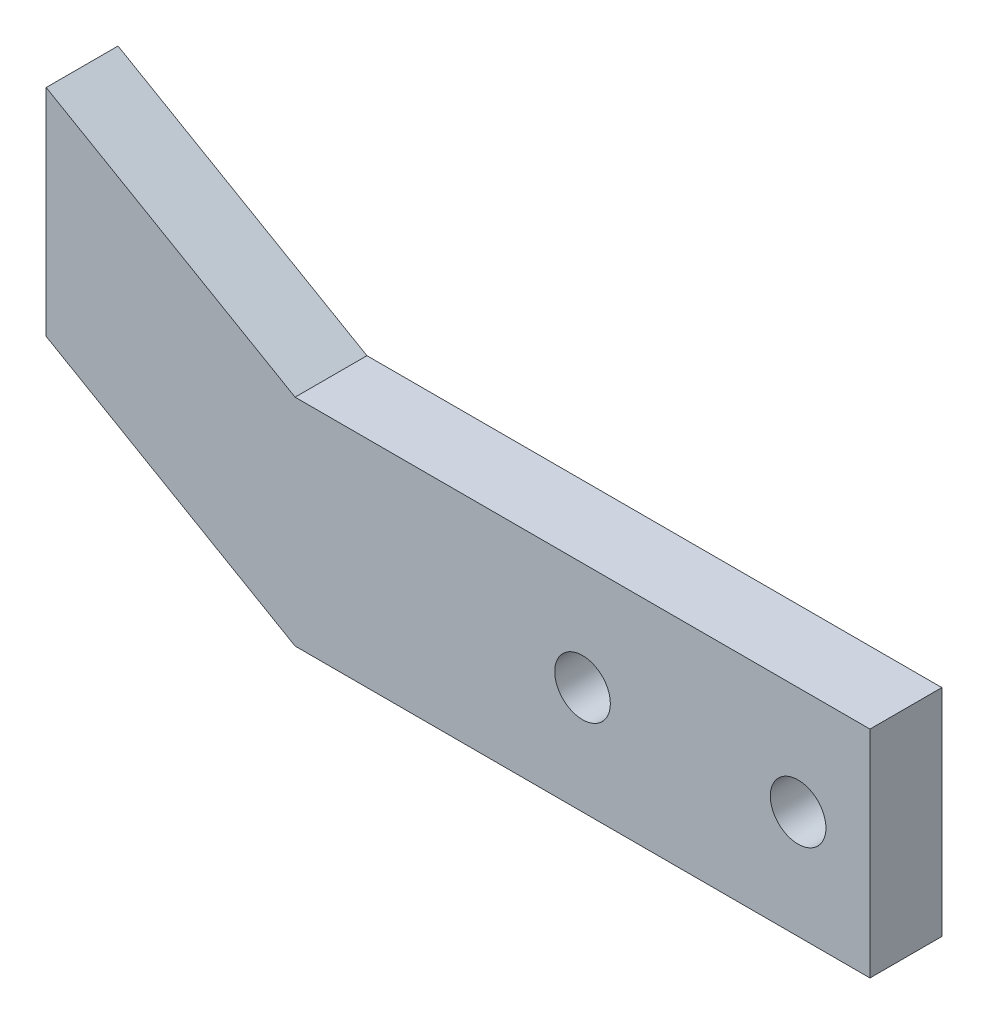
ISO-10303-21;
HEADER;
FILE_DESCRIPTION(('STEP AP214'),'2;1');
FILE_NAME('part.step','',(''),(''),'','','');
FILE_SCHEMA(('AUTOMOTIVE_DESIGN { 1 0 10303 214 1 1 1 1 }'));
ENDSEC;
DATA;
#1=APPLICATION_CONTEXT('core data for automotive mechanical design processes');
#2=APPLICATION_PROTOCOL_DEFINITION('international standard','automotive_design',2000,#1);
#3=PRODUCT_CONTEXT('',#1,'mechanical');
#4=PRODUCT('Part','Part','',(#3));
#5=PRODUCT_RELATED_PRODUCT_CATEGORY('part','',(#4));
#6=PRODUCT_DEFINITION_FORMATION('','',#4);
#7=PRODUCT_DEFINITION_CONTEXT('part definition',#1,'design');
#8=PRODUCT_DEFINITION('design','',#6,#7);
#9=PRODUCT_DEFINITION_SHAPE('','',#8);
#10=(LENGTH_UNIT() NAMED_UNIT(*) SI_UNIT(.MILLI.,.METRE.));
#11=(NAMED_UNIT(*) PLANE_ANGLE_UNIT() SI_UNIT($,.RADIAN.));
#12=(NAMED_UNIT(*) SI_UNIT($,.STERADIAN.) SOLID_ANGLE_UNIT());
#13=UNCERTAINTY_MEASURE_WITH_UNIT(LENGTH_MEASURE(1.E-05),#10,'distance_accuracy_value','');
#14=(GEOMETRIC_REPRESENTATION_CONTEXT(3) GLOBAL_UNCERTAINTY_ASSIGNED_CONTEXT((#13)) GLOBAL_UNIT_ASSIGNED_CONTEXT((#10,
#11,#12)) REPRESENTATION_CONTEXT('',''));
#15=CARTESIAN_POINT('',(0.,0.,0.));
#16=DIRECTION('',(0.,0.,1.));
#17=DIRECTION('',(1.,0.,0.));
#18=AXIS2_PLACEMENT_3D('',#15,#16,#17);
#19=CARTESIAN_POINT('',(0.,0.,6.35));
#20=DIRECTION('',(0.,1.,0.));
#21=DIRECTION('',(0.,0.,1.));
#22=AXIS2_PLACEMENT_3D('',#19,#20,#21);
#23=PLANE('',#22);
#24=DIRECTION('',(1.,0.,0.));
#25=VECTOR('',#24,1.);
#26=CARTESIAN_POINT('',(0.,0.,0.));
#27=LINE('',#26,#25);
#28=CARTESIAN_POINT('',(0.,0.,0.));
#29=VERTEX_POINT('',#28);
#30=CARTESIAN_POINT('',(50.8,0.,0.));
#31=VERTEX_POINT('',#30);
#32=EDGE_CURVE('E117',#29,#31,#27,.T.);
#33=ORIENTED_EDGE('',*,*,#32,.T.);
#34=DIRECTION('',(0.,0.,-1.));
#35=VECTOR('',#34,1.);
#36=CARTESIAN_POINT('',(50.8,0.,6.35));
#37=LINE('',#36,#35);
#38=CARTESIAN_POINT('',(50.8,0.,6.35));
#39=VERTEX_POINT('',#38);
#40=EDGE_CURVE('E11',#39,#31,#37,.T.);
#41=ORIENTED_EDGE('',*,*,#40,.F.);
#42=DIRECTION('',(1.,0.,0.));
#43=VECTOR('',#42,1.);
#44=CARTESIAN_POINT('',(0.,0.,6.35));
#45=LINE('',#44,#43);
#46=CARTESIAN_POINT('',(0.,0.,6.35));
#47=VERTEX_POINT('',#46);
#48=EDGE_CURVE('E128',#47,#39,#45,.T.);
#49=ORIENTED_EDGE('',*,*,#48,.F.);
#50=DIRECTION('',(0.,0.,-1.));
#51=VECTOR('',#50,1.);
#52=CARTESIAN_POINT('',(0.,0.,6.35));
#53=LINE('',#52,#51);
#54=EDGE_CURVE('E113',#47,#29,#53,.T.);
#55=ORIENTED_EDGE('',*,*,#54,.T.);
#56=EDGE_LOOP('',(#33,#41,#49,#55));
#57=FACE_BOUND('',#56,.T.);
#58=ADVANCED_FACE('F33',(#57),#23,.F.);
#59=CARTESIAN_POINT('',(50.8,0.,6.35));
#60=DIRECTION('',(-1.,0.,0.));
#61=DIRECTION('',(0.,0.,1.));
#62=AXIS2_PLACEMENT_3D('',#59,#60,#61);
#63=PLANE('',#62);
#64=DIRECTION('',(0.,1.,0.));
#65=VECTOR('',#64,1.);
#66=CARTESIAN_POINT('',(50.8,0.,0.));
#67=LINE('',#66,#65);
#68=CARTESIAN_POINT('',(50.8,19.05,0.));
#69=VERTEX_POINT('',#68);
#70=EDGE_CURVE('E120',#31,#69,#67,.T.);
#71=ORIENTED_EDGE('',*,*,#70,.T.);
#72=DIRECTION('',(0.,0.,-1.));
#73=VECTOR('',#72,1.);
#74=CARTESIAN_POINT('',(50.8,19.05,6.35));
#75=LINE('',#74,#73);
#76=CARTESIAN_POINT('',(50.8,19.05,6.35));
#77=VERTEX_POINT('',#76);
#78=EDGE_CURVE('E41',#77,#69,#75,.T.);
#79=ORIENTED_EDGE('',*,*,#78,.F.);
#80=DIRECTION('',(0.,1.,0.));
#81=VECTOR('',#80,1.);
#82=CARTESIAN_POINT('',(50.8,0.,6.35));
#83=LINE('',#82,#81);
#84=EDGE_CURVE('E86',#39,#77,#83,.T.);
#85=ORIENTED_EDGE('',*,*,#84,.F.);
#86=ORIENTED_EDGE('',*,*,#40,.T.);
#87=EDGE_LOOP('',(#71,#79,#85,#86));
#88=FACE_BOUND('',#87,.T.);
#89=ADVANCED_FACE('F153',(#88),#63,.F.);
#90=CARTESIAN_POINT('',(0.,19.05,6.35));
#91=DIRECTION('',(0.,-1.,0.));
#92=DIRECTION('',(0.,0.,-1.));
#93=AXIS2_PLACEMENT_3D('',#90,#91,#92);
#94=PLANE('',#93);
#95=DIRECTION('',(-1.,0.,0.));
#96=VECTOR('',#95,1.);
#97=CARTESIAN_POINT('',(0.,19.05,0.));
#98=LINE('',#97,#96);
#99=CARTESIAN_POINT('',(0.,19.05,0.));
#100=VERTEX_POINT('',#99);
#101=EDGE_CURVE('E123',#69,#100,#98,.T.);
#102=ORIENTED_EDGE('',*,*,#101,.T.);
#103=DIRECTION('',(0.,0.,-1.));
#104=VECTOR('',#103,1.);
#105=CARTESIAN_POINT('',(0.,19.05,6.35));
#106=LINE('',#105,#104);
#107=CARTESIAN_POINT('',(0.,19.05,6.35));
#108=VERTEX_POINT('',#107);
#109=EDGE_CURVE('E108',#108,#100,#106,.T.);
#110=ORIENTED_EDGE('',*,*,#109,.F.);
#111=DIRECTION('',(-1.,0.,0.));
#112=VECTOR('',#111,1.);
#113=CARTESIAN_POINT('',(0.,19.05,6.35));
#114=LINE('',#113,#112);
#115=EDGE_CURVE('E99',#77,#108,#114,.T.);
#116=ORIENTED_EDGE('',*,*,#115,.F.);
#117=ORIENTED_EDGE('',*,*,#78,.T.);
#118=EDGE_LOOP('',(#102,#110,#116,#117));
#119=FACE_BOUND('',#118,.T.);
#120=ADVANCED_FACE('F134',(#119),#94,.F.);
#121=CARTESIAN_POINT('',(-21.9970452561247,31.75,6.35));
#122=DIRECTION('',(-0.500000000000001,-0.866025403784438,0.));
#123=DIRECTION('',(0.866025403784438,-0.500000000000001,0.));
#124=AXIS2_PLACEMENT_3D('',#121,#122,#123);
#125=PLANE('',#124);
#126=DIRECTION('',(-0.866025403784438,0.500000000000001,0.));
#127=VECTOR('',#126,1.);
#128=CARTESIAN_POINT('',(-21.9970452561247,31.75,0.));
#129=LINE('',#128,#127);
#130=CARTESIAN_POINT('',(-21.9970452561247,31.75,0.));
#131=VERTEX_POINT('',#130);
#132=EDGE_CURVE('E107',#100,#131,#129,.T.);
#133=ORIENTED_EDGE('',*,*,#132,.T.);
#134=DIRECTION('',(0.,0.,-1.));
#135=VECTOR('',#134,1.);
#136=CARTESIAN_POINT('',(-21.9970452561247,31.75,6.35));
#137=LINE('',#136,#135);
#138=CARTESIAN_POINT('',(-21.9970452561247,31.75,6.35));
#139=VERTEX_POINT('',#138);
#140=EDGE_CURVE('E104',#139,#131,#137,.T.);
#141=ORIENTED_EDGE('',*,*,#140,.F.);
#142=DIRECTION('',(-0.866025403784438,0.500000000000001,0.));
#143=VECTOR('',#142,1.);
#144=CARTESIAN_POINT('',(-21.9970452561247,31.75,6.35));
#145=LINE('',#144,#143);
#146=EDGE_CURVE('E93',#108,#139,#145,.T.);
#147=ORIENTED_EDGE('',*,*,#146,.F.);
#148=ORIENTED_EDGE('',*,*,#109,.T.);
#149=EDGE_LOOP('',(#133,#141,#147,#148));
#150=FACE_BOUND('',#149,.T.);
#151=ADVANCED_FACE('F105',(#150),#125,.F.);
#152=CARTESIAN_POINT('',(-21.9970452561246,12.7000000000002,6.35));
#153=DIRECTION('',(1.,0.,0.));
#154=DIRECTION('',(0.,1.,0.));
#155=AXIS2_PLACEMENT_3D('',#152,#153,#154);
#156=PLANE('',#155);
#157=DIRECTION('',(0.,-1.,0.));
#158=VECTOR('',#157,1.);
#159=CARTESIAN_POINT('',(-21.9970452561246,12.7000000000002,0.));
#160=LINE('',#159,#158);
#161=CARTESIAN_POINT('',(-21.9970452561246,12.7000000000002,0.));
#162=VERTEX_POINT('',#161);
#163=EDGE_CURVE('E72',#131,#162,#160,.T.);
#164=ORIENTED_EDGE('',*,*,#163,.T.);
#165=DIRECTION('',(0.,0.,-1.));
#166=VECTOR('',#165,1.);
#167=CARTESIAN_POINT('',(-21.9970452561246,12.7000000000002,6.35));
#168=LINE('',#167,#166);
#169=CARTESIAN_POINT('',(-21.9970452561246,12.7000000000002,6.35));
#170=VERTEX_POINT('',#169);
#171=EDGE_CURVE('E109',#170,#162,#168,.T.);
#172=ORIENTED_EDGE('',*,*,#171,.F.);
#173=DIRECTION('',(0.,-1.,0.));
#174=VECTOR('',#173,1.);
#175=CARTESIAN_POINT('',(-21.9970452561246,12.7000000000002,6.35));
#176=LINE('',#175,#174);
#177=EDGE_CURVE('E97',#139,#170,#176,.T.);
#178=ORIENTED_EDGE('',*,*,#177,.F.);
#179=ORIENTED_EDGE('',*,*,#140,.T.);
#180=EDGE_LOOP('',(#164,#172,#178,#179));
#181=FACE_BOUND('',#180,.T.);
#182=ADVANCED_FACE('F111',(#181),#156,.F.);
#183=CARTESIAN_POINT('',(0.,0.,6.35));
#184=DIRECTION('',(0.500000000000007,0.866025403784434,0.));
#185=DIRECTION('',(-0.866025403784435,0.500000000000007,0.));
#186=AXIS2_PLACEMENT_3D('',#183,#184,#185);
#187=PLANE('',#186);
#188=DIRECTION('',(0.866025403784434,-0.500000000000007,0.));
#189=VECTOR('',#188,1.);
#190=CARTESIAN_POINT('',(0.,0.,0.));
#191=LINE('',#190,#189);
#192=EDGE_CURVE('E78',#162,#29,#191,.T.);
#193=ORIENTED_EDGE('',*,*,#192,.T.);
#194=ORIENTED_EDGE('',*,*,#54,.F.);
#195=DIRECTION('',(0.866025403784434,-0.500000000000007,0.));
#196=VECTOR('',#195,1.);
#197=CARTESIAN_POINT('',(0.,0.,6.35));
#198=LINE('',#197,#196);
#199=EDGE_CURVE('E49',#170,#47,#198,.T.);
#200=ORIENTED_EDGE('',*,*,#199,.F.);
#201=ORIENTED_EDGE('',*,*,#171,.T.);
#202=EDGE_LOOP('',(#193,#194,#200,#201));
#203=FACE_BOUND('',#202,.T.);
#204=ADVANCED_FACE('F141',(#203),#187,.F.);
#205=CARTESIAN_POINT('',(0.,0.,6.35));
#206=DIRECTION('',(0.,0.,1.));
#207=DIRECTION('',(1.,0.,0.));
#208=AXIS2_PLACEMENT_3D('',#205,#206,#207);
#209=PLANE('',#208);
#210=CARTESIAN_POINT('',(44.45,9.525,6.35));
#211=DIRECTION('',(0.,0.,1.));
#212=DIRECTION('',(1.,0.,0.));
#213=AXIS2_PLACEMENT_3D('',#210,#211,#212);
#214=CIRCLE('',#213,2.45744999999999);
#215=CARTESIAN_POINT('',(46.90745,9.525,6.35));
#216=VERTEX_POINT('',#215);
#217=EDGE_CURVE('E219',#216,#216,#214,.T.);
#218=ORIENTED_EDGE('',*,*,#217,.F.);
#219=EDGE_LOOP('',(#218));
#220=FACE_BOUND('',#219,.T.);
#221=CARTESIAN_POINT('',(25.4,9.525,6.35));
#222=DIRECTION('',(0.,0.,1.));
#223=DIRECTION('',(1.,0.,0.));
#224=AXIS2_PLACEMENT_3D('',#221,#222,#223);
#225=CIRCLE('',#224,2.45744999999999);
#226=CARTESIAN_POINT('',(27.85745,9.525,6.35));
#227=VERTEX_POINT('',#226);
#228=EDGE_CURVE('E221',#227,#227,#225,.T.);
#229=ORIENTED_EDGE('',*,*,#228,.F.);
#230=EDGE_LOOP('',(#229));
#231=FACE_BOUND('',#230,.T.);
#232=ORIENTED_EDGE('',*,*,#48,.T.);
#233=ORIENTED_EDGE('',*,*,#84,.T.);
#234=ORIENTED_EDGE('',*,*,#115,.T.);
#235=ORIENTED_EDGE('',*,*,#146,.T.);
#236=ORIENTED_EDGE('',*,*,#177,.T.);
#237=ORIENTED_EDGE('',*,*,#199,.T.);
#238=EDGE_LOOP('',(#232,#233,#234,#235,#236,#237));
#239=FACE_BOUND('',#238,.T.);
#240=ADVANCED_FACE('F95',(#220,#231,#239),#209,.T.);
#241=CARTESIAN_POINT('',(0.,0.,0.));
#242=DIRECTION('',(0.,0.,1.));
#243=DIRECTION('',(1.,0.,0.));
#244=AXIS2_PLACEMENT_3D('',#241,#242,#243);
#245=PLANE('',#244);
#246=CARTESIAN_POINT('',(44.45,9.525,0.));
#247=DIRECTION('',(0.,0.,1.));
#248=DIRECTION('',(1.,0.,0.));
#249=AXIS2_PLACEMENT_3D('',#246,#247,#248);
#250=CIRCLE('',#249,2.45744999999999);
#251=CARTESIAN_POINT('',(46.90745,9.525,0.));
#252=VERTEX_POINT('',#251);
#253=EDGE_CURVE('E216',#252,#252,#250,.T.);
#254=ORIENTED_EDGE('',*,*,#253,.T.);
#255=EDGE_LOOP('',(#254));
#256=FACE_BOUND('',#255,.T.);
#257=CARTESIAN_POINT('',(25.4,9.525,0.));
#258=DIRECTION('',(0.,0.,1.));
#259=DIRECTION('',(1.,0.,0.));
#260=AXIS2_PLACEMENT_3D('',#257,#258,#259);
#261=CIRCLE('',#260,2.45744999999999);
#262=CARTESIAN_POINT('',(27.85745,9.525,0.));
#263=VERTEX_POINT('',#262);
#264=EDGE_CURVE('E121',#263,#263,#261,.T.);
#265=ORIENTED_EDGE('',*,*,#264,.T.);
#266=EDGE_LOOP('',(#265));
#267=FACE_BOUND('',#266,.T.);
#268=ORIENTED_EDGE('',*,*,#32,.F.);
#269=ORIENTED_EDGE('',*,*,#192,.F.);
#270=ORIENTED_EDGE('',*,*,#163,.F.);
#271=ORIENTED_EDGE('',*,*,#132,.F.);
#272=ORIENTED_EDGE('',*,*,#101,.F.);
#273=ORIENTED_EDGE('',*,*,#70,.F.);
#274=EDGE_LOOP('',(#268,#269,#270,#271,#272,#273));
#275=FACE_BOUND('',#274,.T.);
#276=ADVANCED_FACE('F137',(#256,#267,#275),#245,.F.);
#277=CARTESIAN_POINT('',(25.4,9.525,6.35));
#278=DIRECTION('',(0.,0.,1.));
#279=DIRECTION('',(1.,0.,0.));
#280=AXIS2_PLACEMENT_3D('',#277,#278,#279);
#281=CYLINDRICAL_SURFACE('',#280,2.45744999999999);
#282=ORIENTED_EDGE('',*,*,#264,.F.);
#283=EDGE_LOOP('',(#282));
#284=FACE_BOUND('',#283,.T.);
#285=ORIENTED_EDGE('',*,*,#228,.T.);
#286=EDGE_LOOP('',(#285));
#287=FACE_BOUND('',#286,.T.);
#288=ADVANCED_FACE('F190',(#284,#287),#281,.F.);
#289=CARTESIAN_POINT('',(44.45,9.525,6.35));
#290=DIRECTION('',(0.,0.,1.));
#291=DIRECTION('',(1.,0.,0.));
#292=AXIS2_PLACEMENT_3D('',#289,#290,#291);
#293=CYLINDRICAL_SURFACE('',#292,2.45744999999999);
#294=ORIENTED_EDGE('',*,*,#253,.F.);
#295=EDGE_LOOP('',(#294));
#296=FACE_BOUND('',#295,.T.);
#297=ORIENTED_EDGE('',*,*,#217,.T.);
#298=EDGE_LOOP('',(#297));
#299=FACE_BOUND('',#298,.T.);
#300=ADVANCED_FACE('F199',(#296,#299),#293,.F.);
#301=CLOSED_SHELL('',(#58,#89,#120,#151,#182,#204,#240,#276,#288,#300));
#302=MANIFOLD_SOLID_BREP('B2',#301);
#303=ADVANCED_BREP_SHAPE_REPRESENTATION('',(#18,#302),#14);
#304=SHAPE_DEFINITION_REPRESENTATION(#9,#303);
ENDSEC;
END-ISO-10303-21;
